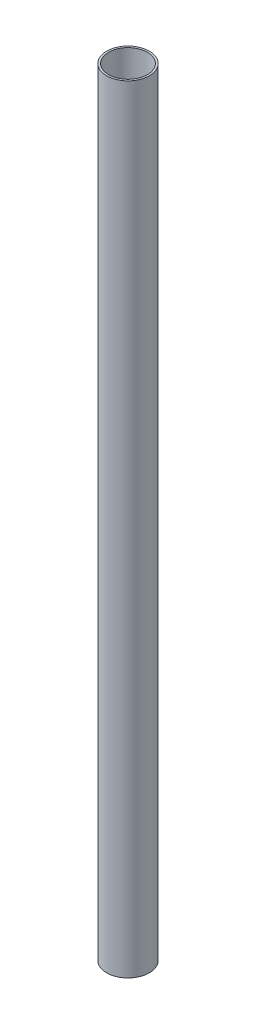
ISO-10303-21;
HEADER;
FILE_DESCRIPTION(('STEP AP214'),'2;1');
FILE_NAME('part.step','',(''),(''),'','','');
FILE_SCHEMA(('AUTOMOTIVE_DESIGN { 1 0 10303 214 1 1 1 1 }'));
ENDSEC;
DATA;
#1=APPLICATION_CONTEXT('core data for automotive mechanical design processes');
#2=APPLICATION_PROTOCOL_DEFINITION('international standard','automotive_design',2000,#1);
#3=PRODUCT_CONTEXT('',#1,'mechanical');
#4=PRODUCT('Part','Part','',(#3));
#5=PRODUCT_RELATED_PRODUCT_CATEGORY('part','',(#4));
#6=PRODUCT_DEFINITION_FORMATION('','',#4);
#7=PRODUCT_DEFINITION_CONTEXT('part definition',#1,'design');
#8=PRODUCT_DEFINITION('design','',#6,#7);
#9=PRODUCT_DEFINITION_SHAPE('','',#8);
#10=(LENGTH_UNIT() NAMED_UNIT(*) SI_UNIT(.MILLI.,.METRE.));
#11=(NAMED_UNIT(*) PLANE_ANGLE_UNIT() SI_UNIT($,.RADIAN.));
#12=(NAMED_UNIT(*) SI_UNIT($,.STERADIAN.) SOLID_ANGLE_UNIT());
#13=UNCERTAINTY_MEASURE_WITH_UNIT(LENGTH_MEASURE(1.E-05),#10,'distance_accuracy_value','');
#14=(GEOMETRIC_REPRESENTATION_CONTEXT(3) GLOBAL_UNCERTAINTY_ASSIGNED_CONTEXT((#13)) GLOBAL_UNIT_ASSIGNED_CONTEXT((#10,
#11,#12)) REPRESENTATION_CONTEXT('',''));
#15=CARTESIAN_POINT('',(0.,0.,0.));
#16=DIRECTION('',(0.,0.,1.));
#17=DIRECTION('',(1.,0.,0.));
#18=AXIS2_PLACEMENT_3D('',#15,#16,#17);
#19=CARTESIAN_POINT('',(0.,400.,0.));
#20=DIRECTION('',(0.,1.,0.));
#21=DIRECTION('',(0.,0.,1.));
#22=AXIS2_PLACEMENT_3D('',#19,#20,#21);
#23=PLANE('',#22);
#24=CARTESIAN_POINT('',(0.,400.,0.));
#25=DIRECTION('',(0.,1.,0.));
#26=DIRECTION('',(0.,0.,1.));
#27=AXIS2_PLACEMENT_3D('',#24,#25,#26);
#28=CIRCLE('',#27,11.);
#29=CARTESIAN_POINT('',(0.,400.,11.));
#30=VERTEX_POINT('',#29);
#31=EDGE_CURVE('E10',#30,#30,#28,.T.);
#32=ORIENTED_EDGE('',*,*,#31,.T.);
#33=EDGE_LOOP('',(#32));
#34=FACE_BOUND('',#33,.T.);
#35=CARTESIAN_POINT('',(0.,400.,0.));
#36=DIRECTION('',(0.,1.,0.));
#37=DIRECTION('',(0.,0.,1.));
#38=AXIS2_PLACEMENT_3D('',#35,#36,#37);
#39=CIRCLE('',#38,10.);
#40=CARTESIAN_POINT('',(0.,400.,10.));
#41=VERTEX_POINT('',#40);
#42=EDGE_CURVE('E45',#41,#41,#39,.T.);
#43=ORIENTED_EDGE('',*,*,#42,.F.);
#44=EDGE_LOOP('',(#43));
#45=FACE_BOUND('',#44,.T.);
#46=ADVANCED_FACE('F34',(#34,#45),#23,.T.);
#47=CARTESIAN_POINT('',(0.,0.,0.));
#48=DIRECTION('',(0.,1.,0.));
#49=DIRECTION('',(0.,0.,1.));
#50=AXIS2_PLACEMENT_3D('',#47,#48,#49);
#51=PLANE('',#50);
#52=CARTESIAN_POINT('',(0.,0.,0.));
#53=DIRECTION('',(0.,1.,0.));
#54=DIRECTION('',(0.,0.,1.));
#55=AXIS2_PLACEMENT_3D('',#52,#53,#54);
#56=CIRCLE('',#55,11.);
#57=CARTESIAN_POINT('',(0.,0.,11.));
#58=VERTEX_POINT('',#57);
#59=EDGE_CURVE('E38',#58,#58,#56,.T.);
#60=ORIENTED_EDGE('',*,*,#59,.F.);
#61=EDGE_LOOP('',(#60));
#62=FACE_BOUND('',#61,.T.);
#63=CARTESIAN_POINT('',(0.,0.,0.));
#64=DIRECTION('',(0.,1.,0.));
#65=DIRECTION('',(0.,0.,1.));
#66=AXIS2_PLACEMENT_3D('',#63,#64,#65);
#67=CIRCLE('',#66,10.);
#68=CARTESIAN_POINT('',(0.,0.,10.));
#69=VERTEX_POINT('',#68);
#70=EDGE_CURVE('E47',#69,#69,#67,.T.);
#71=ORIENTED_EDGE('',*,*,#70,.T.);
#72=EDGE_LOOP('',(#71));
#73=FACE_BOUND('',#72,.T.);
#74=ADVANCED_FACE('F57',(#62,#73),#51,.F.);
#75=CARTESIAN_POINT('',(0.,400.,0.));
#76=DIRECTION('',(0.,-1.,0.));
#77=DIRECTION('',(0.,0.,-1.));
#78=AXIS2_PLACEMENT_3D('',#75,#76,#77);
#79=CYLINDRICAL_SURFACE('',#78,11.);
#80=ORIENTED_EDGE('',*,*,#31,.F.);
#81=EDGE_LOOP('',(#80));
#82=FACE_BOUND('',#81,.T.);
#83=ORIENTED_EDGE('',*,*,#59,.T.);
#84=EDGE_LOOP('',(#83));
#85=FACE_BOUND('',#84,.T.);
#86=ADVANCED_FACE('F36',(#82,#85),#79,.T.);
#87=CARTESIAN_POINT('',(0.,400.,0.));
#88=DIRECTION('',(0.,-1.,0.));
#89=DIRECTION('',(0.,0.,-1.));
#90=AXIS2_PLACEMENT_3D('',#87,#88,#89);
#91=CYLINDRICAL_SURFACE('',#90,10.);
#92=ORIENTED_EDGE('',*,*,#42,.T.);
#93=EDGE_LOOP('',(#92));
#94=FACE_BOUND('',#93,.T.);
#95=ORIENTED_EDGE('',*,*,#70,.F.);
#96=EDGE_LOOP('',(#95));
#97=FACE_BOUND('',#96,.T.);
#98=ADVANCED_FACE('F53',(#94,#97),#91,.F.);
#99=CLOSED_SHELL('',(#46,#74,#86,#98));
#100=MANIFOLD_SOLID_BREP('B2',#99);
#101=ADVANCED_BREP_SHAPE_REPRESENTATION('',(#18,#100),#14);
#102=SHAPE_DEFINITION_REPRESENTATION(#9,#101);
ENDSEC;
END-ISO-10303-21;
